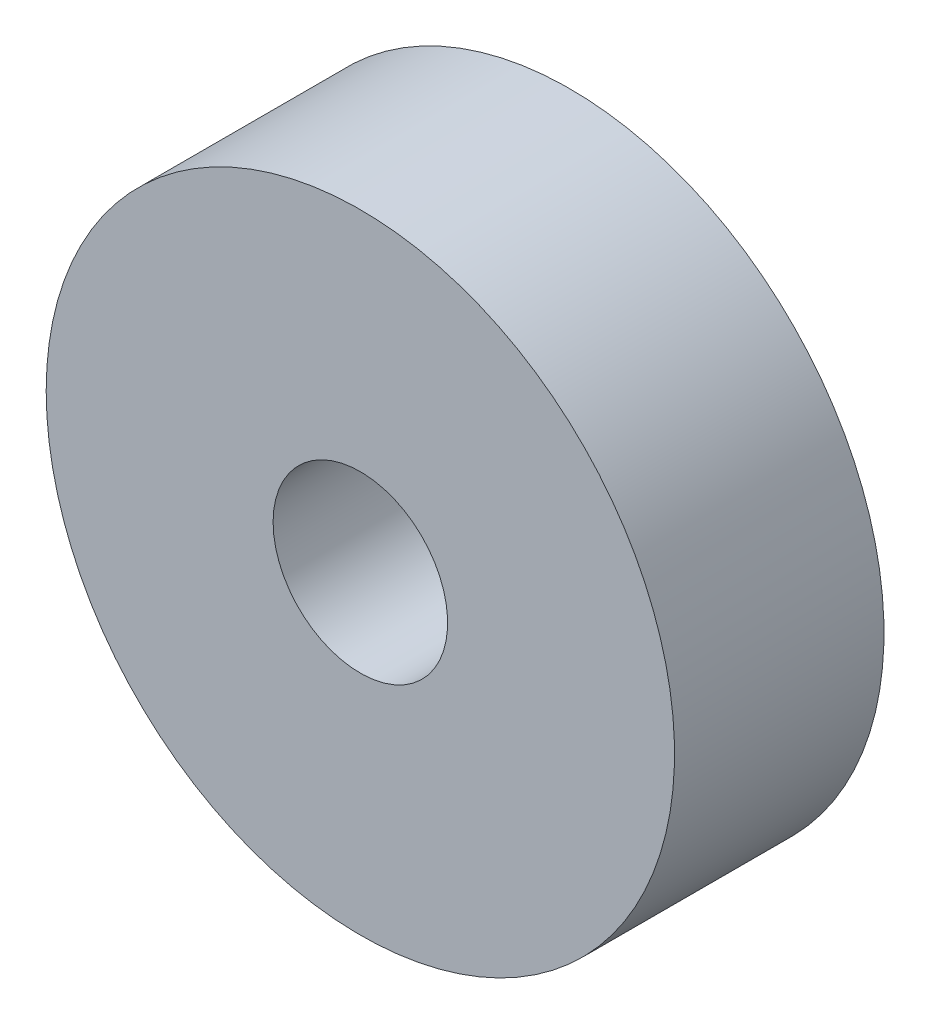
ISO-10303-21;
HEADER;
FILE_DESCRIPTION(('STEP AP214'),'2;1');
FILE_NAME('part.step','',(''),(''),'','','');
FILE_SCHEMA(('AUTOMOTIVE_DESIGN { 1 0 10303 214 1 1 1 1 }'));
ENDSEC;
DATA;
#1=APPLICATION_CONTEXT('core data for automotive mechanical design processes');
#2=APPLICATION_PROTOCOL_DEFINITION('international standard','automotive_design',2000,#1);
#3=PRODUCT_CONTEXT('',#1,'mechanical');
#4=PRODUCT('Part','Part','',(#3));
#5=PRODUCT_RELATED_PRODUCT_CATEGORY('part','',(#4));
#6=PRODUCT_DEFINITION_FORMATION('','',#4);
#7=PRODUCT_DEFINITION_CONTEXT('part definition',#1,'design');
#8=PRODUCT_DEFINITION('design','',#6,#7);
#9=PRODUCT_DEFINITION_SHAPE('','',#8);
#10=(LENGTH_UNIT() NAMED_UNIT(*) SI_UNIT(.MILLI.,.METRE.));
#11=(NAMED_UNIT(*) PLANE_ANGLE_UNIT() SI_UNIT($,.RADIAN.));
#12=(NAMED_UNIT(*) SI_UNIT($,.STERADIAN.) SOLID_ANGLE_UNIT());
#13=UNCERTAINTY_MEASURE_WITH_UNIT(LENGTH_MEASURE(1.E-05),#10,'distance_accuracy_value','');
#14=(GEOMETRIC_REPRESENTATION_CONTEXT(3) GLOBAL_UNCERTAINTY_ASSIGNED_CONTEXT((#13)) GLOBAL_UNIT_ASSIGNED_CONTEXT((#10,
#11,#12)) REPRESENTATION_CONTEXT('',''));
#15=CARTESIAN_POINT('',(0.,0.,0.));
#16=DIRECTION('',(0.,0.,1.));
#17=DIRECTION('',(1.,0.,0.));
#18=AXIS2_PLACEMENT_3D('',#15,#16,#17);
#19=CARTESIAN_POINT('',(0.,0.,-5.99999388390299));
#20=DIRECTION('',(0.,0.,-1.));
#21=DIRECTION('',(-1.,0.,0.));
#22=AXIS2_PLACEMENT_3D('',#19,#20,#21);
#23=CYLINDRICAL_SURFACE('',#22,1.25);
#24=CARTESIAN_POINT('',(0.,0.,-5.99999388390299));
#25=DIRECTION('',(0.,0.,-1.));
#26=DIRECTION('',(-1.,0.,0.));
#27=AXIS2_PLACEMENT_3D('',#24,#25,#26);
#28=CIRCLE('',#27,1.25);
#29=CARTESIAN_POINT('',(-1.25,0.,-5.99999388390299));
#30=VERTEX_POINT('',#29);
#31=EDGE_CURVE('E27',#30,#30,#28,.F.);
#32=ORIENTED_EDGE('',*,*,#31,.T.);
#33=EDGE_LOOP('',(#32));
#34=FACE_BOUND('',#33,.T.);
#35=CARTESIAN_POINT('',(0.,0.,-8.99999388390299));
#36=DIRECTION('',(0.,0.,-1.));
#37=DIRECTION('',(-1.,0.,0.));
#38=AXIS2_PLACEMENT_3D('',#35,#36,#37);
#39=CIRCLE('',#38,1.25);
#40=CARTESIAN_POINT('',(-1.25,0.,-8.99999388390299));
#41=VERTEX_POINT('',#40);
#42=EDGE_CURVE('E18',#41,#41,#39,.F.);
#43=ORIENTED_EDGE('',*,*,#42,.F.);
#44=EDGE_LOOP('',(#43));
#45=FACE_BOUND('',#44,.T.);
#46=ADVANCED_FACE('F15',(#34,#45),#23,.F.);
#47=CARTESIAN_POINT('',(0.,0.,-8.99999388390299));
#48=DIRECTION('',(0.,0.,-1.));
#49=DIRECTION('',(-1.,0.,0.));
#50=AXIS2_PLACEMENT_3D('',#47,#48,#49);
#51=PLANE('',#50);
#52=ORIENTED_EDGE('',*,*,#42,.T.);
#53=EDGE_LOOP('',(#52));
#54=FACE_BOUND('',#53,.T.);
#55=CARTESIAN_POINT('',(0.,0.,-8.99999388390299));
#56=DIRECTION('',(0.,0.,-1.));
#57=DIRECTION('',(-1.,0.,0.));
#58=AXIS2_PLACEMENT_3D('',#55,#56,#57);
#59=CIRCLE('',#58,4.5);
#60=CARTESIAN_POINT('',(-4.5,0.,-8.99999388390299));
#61=VERTEX_POINT('',#60);
#62=EDGE_CURVE('E22',#61,#61,#59,.F.);
#63=ORIENTED_EDGE('',*,*,#62,.F.);
#64=EDGE_LOOP('',(#63));
#65=FACE_BOUND('',#64,.T.);
#66=ADVANCED_FACE('F35',(#54,#65),#51,.T.);
#67=CARTESIAN_POINT('',(0.,0.,-5.99999388390299));
#68=DIRECTION('',(0.,0.,-1.));
#69=DIRECTION('',(-1.,0.,0.));
#70=AXIS2_PLACEMENT_3D('',#67,#68,#69);
#71=PLANE('',#70);
#72=ORIENTED_EDGE('',*,*,#31,.F.);
#73=EDGE_LOOP('',(#72));
#74=FACE_BOUND('',#73,.T.);
#75=CARTESIAN_POINT('',(0.,0.,-5.99999388390299));
#76=DIRECTION('',(0.,0.,-1.));
#77=DIRECTION('',(-1.,0.,0.));
#78=AXIS2_PLACEMENT_3D('',#75,#76,#77);
#79=CIRCLE('',#78,4.5);
#80=CARTESIAN_POINT('',(-4.5,0.,-5.99999388390299));
#81=VERTEX_POINT('',#80);
#82=EDGE_CURVE('E10',#81,#81,#79,.T.);
#83=ORIENTED_EDGE('',*,*,#82,.F.);
#84=EDGE_LOOP('',(#83));
#85=FACE_BOUND('',#84,.T.);
#86=ADVANCED_FACE('F43',(#74,#85),#71,.F.);
#87=CARTESIAN_POINT('',(0.,0.,-5.99999388390299));
#88=DIRECTION('',(0.,0.,-1.));
#89=DIRECTION('',(-1.,0.,0.));
#90=AXIS2_PLACEMENT_3D('',#87,#88,#89);
#91=CYLINDRICAL_SURFACE('',#90,4.5);
#92=ORIENTED_EDGE('',*,*,#82,.T.);
#93=EDGE_LOOP('',(#92));
#94=FACE_BOUND('',#93,.T.);
#95=ORIENTED_EDGE('',*,*,#62,.T.);
#96=EDGE_LOOP('',(#95));
#97=FACE_BOUND('',#96,.T.);
#98=ADVANCED_FACE('F44',(#94,#97),#91,.T.);
#99=CLOSED_SHELL('',(#46,#66,#86,#98));
#100=MANIFOLD_SOLID_BREP('B1',#99);
#101=ADVANCED_BREP_SHAPE_REPRESENTATION('',(#18,#100),#14);
#102=SHAPE_DEFINITION_REPRESENTATION(#9,#101);
ENDSEC;
END-ISO-10303-21;
